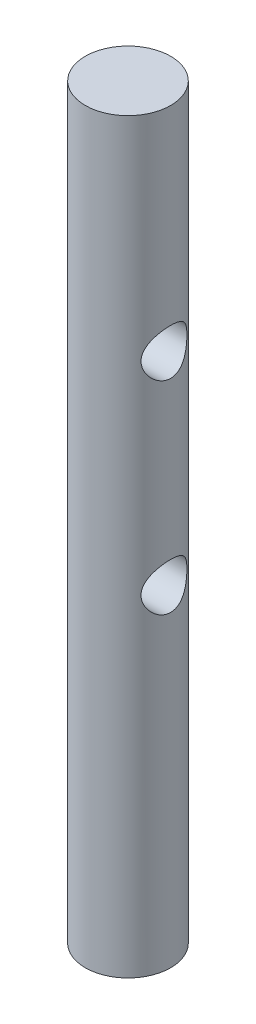
ISO-10303-21;
HEADER;
FILE_DESCRIPTION(('STEP AP214'),'2;1');
FILE_NAME('part.step','',(''),(''),'','','');
FILE_SCHEMA(('AUTOMOTIVE_DESIGN { 1 0 10303 214 1 1 1 1 }'));
ENDSEC;
DATA;
#1=APPLICATION_CONTEXT('core data for automotive mechanical design processes');
#2=APPLICATION_PROTOCOL_DEFINITION('international standard','automotive_design',2000,#1);
#3=PRODUCT_CONTEXT('',#1,'mechanical');
#4=PRODUCT('Part','Part','',(#3));
#5=PRODUCT_RELATED_PRODUCT_CATEGORY('part','',(#4));
#6=PRODUCT_DEFINITION_FORMATION('','',#4);
#7=PRODUCT_DEFINITION_CONTEXT('part definition',#1,'design');
#8=PRODUCT_DEFINITION('design','',#6,#7);
#9=PRODUCT_DEFINITION_SHAPE('','',#8);
#10=(LENGTH_UNIT() NAMED_UNIT(*) SI_UNIT(.MILLI.,.METRE.));
#11=(NAMED_UNIT(*) PLANE_ANGLE_UNIT() SI_UNIT($,.RADIAN.));
#12=(NAMED_UNIT(*) SI_UNIT($,.STERADIAN.) SOLID_ANGLE_UNIT());
#13=UNCERTAINTY_MEASURE_WITH_UNIT(LENGTH_MEASURE(1.E-05),#10,'distance_accuracy_value','');
#14=(GEOMETRIC_REPRESENTATION_CONTEXT(3) GLOBAL_UNCERTAINTY_ASSIGNED_CONTEXT((#13)) GLOBAL_UNIT_ASSIGNED_CONTEXT((#10,
#11,#12)) REPRESENTATION_CONTEXT('',''));
#15=CARTESIAN_POINT('',(0.,0.,0.));
#16=DIRECTION('',(0.,0.,1.));
#17=DIRECTION('',(1.,0.,0.));
#18=AXIS2_PLACEMENT_3D('',#15,#16,#17);
#19=CARTESIAN_POINT('',(0.,70.,0.));
#20=DIRECTION('',(0.,-1.,0.));
#21=DIRECTION('',(0.,0.,-1.));
#22=AXIS2_PLACEMENT_3D('',#19,#20,#21);
#23=CYLINDRICAL_SURFACE('',#22,4.);
#24=CARTESIAN_POINT('',(-4.,47.85,0.));
#25=CARTESIAN_POINT('',(-3.99999241042919,47.8500087172234,-0.111985083549888));
#26=CARTESIAN_POINT('',(-3.99524813697612,47.8588010255082,-0.224077490488077));
#27=CARTESIAN_POINT('',(-3.97673372012221,47.8935531917163,-0.444880967120356));
#28=CARTESIAN_POINT('',(-3.96295000909767,47.9195388563022,-0.553586696306075));
#29=CARTESIAN_POINT('',(-3.92778453505629,47.9873337720753,-0.764103901168655));
#30=CARTESIAN_POINT('',(-3.90643368940093,48.0290786796246,-0.86594145245919));
#31=CARTESIAN_POINT('',(-3.85803554037742,48.1268372396842,-1.06097774173743));
#32=CARTESIAN_POINT('',(-3.83098815527048,48.1828510969398,-1.15417635573871));
#33=CARTESIAN_POINT('',(-3.77148717336829,48.311775155938,-1.33628687887393));
#34=CARTESIAN_POINT('',(-3.73879318014561,48.3855638416462,-1.42449699630782));
#35=CARTESIAN_POINT('',(-3.67235783961419,48.5460229794877,-1.58795061149791));
#36=CARTESIAN_POINT('',(-3.63861559096915,48.6327047746383,-1.66318256424729));
#37=CARTESIAN_POINT('',(-3.57023950857991,48.8261033552469,-1.80560065254836));
#38=CARTESIAN_POINT('',(-3.53581462630107,48.9339337073277,-1.87138771426557));
#39=CARTESIAN_POINT('',(-3.47409559446628,49.161114484262,-1.98362962104654));
#40=CARTESIAN_POINT('',(-3.44679590325984,49.2804558568255,-2.03009950690743));
#41=CARTESIAN_POINT('',(-3.40516584404437,49.519776090643,-2.09914059071749));
#42=CARTESIAN_POINT('',(-3.390129360264,49.6392453871042,-2.12302804619301));
#43=CARTESIAN_POINT('',(-3.37299276237296,49.8813580710808,-2.15016503034598));
#44=CARTESIAN_POINT('',(-3.37087578577,50.0039971112893,-2.15344146062832));
#45=CARTESIAN_POINT('',(-3.37926908617843,50.2299621735856,-2.14022339446676));
#46=CARTESIAN_POINT('',(-3.38801064528115,50.3335338030288,-2.126499027442));
#47=CARTESIAN_POINT('',(-3.41398306573744,50.5365917213163,-2.08454378577752));
#48=CARTESIAN_POINT('',(-3.43121744815182,50.6360762971497,-2.05630689414518));
#49=CARTESIAN_POINT('',(-3.47255686356862,50.8309292631316,-1.98570998012338));
#50=CARTESIAN_POINT('',(-3.49680637319131,50.9261566256099,-1.94304940884755));
#51=CARTESIAN_POINT('',(-3.5494819153084,51.1085862709489,-1.84506639648014));
#52=CARTESIAN_POINT('',(-3.57790978699198,51.1957849922119,-1.78973837354591));
#53=CARTESIAN_POINT('',(-3.64086026982543,51.3734127309326,-1.65837107693041));
#54=CARTESIAN_POINT('',(-3.67565843778587,51.4623735182733,-1.58047165721853));
#55=CARTESIAN_POINT('',(-3.74404329998364,51.6266350389099,-1.41085349097821));
#56=CARTESIAN_POINT('',(-3.77762922261182,51.701927190649,-1.31912612856053));
#57=CARTESIAN_POINT('',(-3.84229866335277,51.841138546543,-1.11741582683789));
#58=CARTESIAN_POINT('',(-3.87310210413084,51.9040761879419,-1.00665800192928));
#59=CARTESIAN_POINT('',(-3.92619426387664,52.0098762667568,-0.774065516608712));
#60=CARTESIAN_POINT('',(-3.94849068166452,52.0527568636937,-0.652240995745133));
#61=CARTESIAN_POINT('',(-3.98030644034244,52.1132761052938,-0.412797211692436));
#62=CARTESIAN_POINT('',(-3.99080138540045,52.132851727303,-0.295799016079746));
#63=CARTESIAN_POINT('',(-4.00129452271238,52.1524250425793,-0.0597330243300772));
#64=CARTESIAN_POINT('',(-4.00129893855782,52.1524343437245,0.0593335028211603));
#65=CARTESIAN_POINT('',(-3.99132016755876,52.1338184571408,0.284399869544176));
#66=CARTESIAN_POINT('',(-3.98226017773824,52.1169157261968,0.390590169182914));
#67=CARTESIAN_POINT('',(-3.95637725730819,52.0678141724343,0.598366693495298));
#68=CARTESIAN_POINT('',(-3.93955352478026,52.0356137695063,0.699952441373293));
#69=CARTESIAN_POINT('',(-3.89911528070355,51.956219043406,0.898571189153841));
#70=CARTESIAN_POINT('',(-3.87534533639925,51.9086785926811,0.99543301370582));
#71=CARTESIAN_POINT('',(-3.82317096683462,51.8003850720905,1.18007767122399));
#72=CARTESIAN_POINT('',(-3.79476476110472,51.739626923219,1.26785699498088));
#73=CARTESIAN_POINT('',(-3.73230165289247,51.5990512465211,1.4420067470224));
#74=CARTESIAN_POINT('',(-3.69796619892198,51.5178794162935,1.52718528640786));
#75=CARTESIAN_POINT('',(-3.62955448193818,51.3426378968988,1.68333503411259));
#76=CARTESIAN_POINT('',(-3.59547849628594,51.2485560224493,1.75429266230863));
#77=CARTESIAN_POINT('',(-3.5289133178125,51.0420772707768,1.88480969934338));
#78=CARTESIAN_POINT('',(-3.49670129160335,50.9288600598413,1.94322649819338));
#79=CARTESIAN_POINT('',(-3.44139375848823,50.6919925495398,2.03959121842095));
#80=CARTESIAN_POINT('',(-3.41828518270863,50.5683575179847,2.07756851157813));
#81=CARTESIAN_POINT('',(-3.38696436894619,50.3269509175665,2.1282114277317));
#82=CARTESIAN_POINT('',(-3.3775159604708,50.2097890491257,2.14298986871183));
#83=CARTESIAN_POINT('',(-3.37110589298399,49.9743222783088,2.15306681805448));
#84=CARTESIAN_POINT('',(-3.37413521781325,49.8560182628726,2.14837939204122));
#85=CARTESIAN_POINT('',(-3.39095526288104,49.6373833976624,2.12169848755743));
#86=CARTESIAN_POINT('',(-3.4033522024359,49.5366556861827,2.10194354886375));
#87=CARTESIAN_POINT('',(-3.43562345400984,49.3401399524347,2.04876867511861));
#88=CARTESIAN_POINT('',(-3.45550060489385,49.244353821292,2.01534355158559));
#89=CARTESIAN_POINT('',(-3.50200902421991,49.0535958420442,1.93346217813749));
#90=CARTESIAN_POINT('',(-3.52899009970315,48.9590652286216,1.88418349989918));
#91=CARTESIAN_POINT('',(-3.58623565491193,48.7789804057067,1.77280466826671));
#92=CARTESIAN_POINT('',(-3.61650189580489,48.69343105987,1.71069762135228));
#93=CARTESIAN_POINT('',(-3.68224952917989,48.5205511696197,1.56471752559222));
#94=CARTESIAN_POINT('',(-3.71784105438733,48.4348230587722,1.47898463326489));
#95=CARTESIAN_POINT('',(-3.78631896326831,48.2784737950109,1.29366436225303));
#96=CARTESIAN_POINT('',(-3.81920354175472,48.2078626737577,1.19406785553323));
#97=CARTESIAN_POINT('',(-3.87972360692406,48.0822206247598,0.979989617524251));
#98=CARTESIAN_POINT('',(-3.90719519253341,48.0276568748057,0.865181032785213));
#99=CARTESIAN_POINT('',(-3.94118669682048,47.9614225009985,0.686122175517971));
#100=CARTESIAN_POINT('',(-3.95131064062383,47.9419532558644,0.625333387256215));
#101=CARTESIAN_POINT('',(-3.96887321153499,47.9084308283745,0.501914482823136));
#102=CARTESIAN_POINT('',(-3.97631330704083,47.8943746840955,0.439285393872384));
#103=CARTESIAN_POINT('',(-3.98812704014167,47.8721503741494,0.31416799923318));
#104=CARTESIAN_POINT('',(-3.99256578620078,47.863857076314,0.251708114126207));
#105=CARTESIAN_POINT('',(-3.99850441465378,47.8527794141583,0.126176849031563));
#106=CARTESIAN_POINT('',(-4.00000427684991,47.849995087699,0.063105464844301));
#107=CARTESIAN_POINT('',(-4.,47.85,0.));
#108=B_SPLINE_CURVE_WITH_KNOTS('',3,(#24,#25,#26,#27,#28,#29,#30,#31,#32,#33,#34,#35,#36,#37,
#38,#39,#40,#41,#42,#43,#44,#45,#46,#47,#48,#49,#50,#51,#52,#53,#54,#55,#56,#57,#58,#59,#60,#61,
#62,#63,#64,#65,#66,#67,#68,#69,#70,#71,#72,#73,#74,#75,#76,#77,#78,#79,#80,#81,#82,#83,#84,#85,
#86,#87,#88,#89,#90,#91,#92,#93,#94,#95,#96,#97,#98,#99,#100,#101,#102,#103,#104,#105,#106,
#107),.UNSPECIFIED.,.T.,.F.,(4,2,2,2,2,2,2,2,2,2,2,2,2,2,2,2,2,2,2,2,2,2,2,2,2,2,2,2,2,2,2,2,2,
2,2,2,2,2,2,2,2,4),(0.,0.335710391978373,0.671925820794775,1.00678310241752,1.34164518918348,
1.69886736408739,2.05640569313897,2.44719722292653,2.83768390091528,3.20367633738306,
3.56919097955531,3.88224513770468,4.19542919509354,4.51558861443918,4.83588938271311,
5.20410660078069,5.57255420254336,5.96361403901208,6.35431912374402,6.70958078958072,
7.06463169350078,7.38686237569236,7.70912634860158,8.03924028022703,8.36948128552757,
8.73564475995621,9.10215624984545,9.49427270335817,9.88582416673056,10.2390691232301,
10.5920588768167,10.9008858996852,11.2098302459518,11.5384708215192,11.8672884587277,
12.2446617203924,12.6222846366531,13.0100066433899,13.2036355995073,13.3971584553028,
13.5863355677526,13.7755139803349),.UNSPECIFIED.);
#109=CARTESIAN_POINT('',(-4.,47.85,0.));
#110=VERTEX_POINT('',#109);
#111=EDGE_CURVE('E10',#110,#110,#108,.T.);
#112=ORIENTED_EDGE('',*,*,#111,.T.);
#113=EDGE_LOOP('',(#112));
#114=FACE_BOUND('',#113,.T.);
#115=CARTESIAN_POINT('',(3.37305499510459,50.,-2.15));
#116=CARTESIAN_POINT('',(3.37306789537478,49.8893350463173,-2.14999014185175));
#117=CARTESIAN_POINT('',(3.37858717241774,49.7785567272247,-2.14139612338367));
#118=CARTESIAN_POINT('',(3.3998217485846,49.5605137953804,-2.10750636967658));
#119=CARTESIAN_POINT('',(3.4155552495845,49.4532558150743,-2.08218081720836));
#120=CARTESIAN_POINT('',(3.45484291183156,49.2458325735096,-2.01631028763128));
#121=CARTESIAN_POINT('',(3.47835014687402,49.1456290267439,-1.97585644534699));
#122=CARTESIAN_POINT('',(3.53046178707916,48.9534646806579,-1.88115733110661));
#123=CARTESIAN_POINT('',(3.55906708056218,48.8615053220652,-1.82690965491503));
#124=CARTESIAN_POINT('',(3.62149973907626,48.6786972630355,-1.70005797545115));
#125=CARTESIAN_POINT('',(3.65556474336205,48.5888063103755,-1.62619018009122));
#126=CARTESIAN_POINT('',(3.7231695035592,48.4219263740329,-1.46480980763115));
#127=CARTESIAN_POINT('',(3.75670894981218,48.3449447552128,-1.37728949626047));
#128=CARTESIAN_POINT('',(3.82272142222174,48.199944463291,-1.18245593288972));
#129=CARTESIAN_POINT('',(3.85488851267948,48.1331552272761,-1.07411410314494));
#130=CARTESIAN_POINT('',(3.91134641658503,48.0191954947069,-0.845676271264341));
#131=CARTESIAN_POINT('',(3.93564296040725,47.9720107174653,-0.725588904114212));
#132=CARTESIAN_POINT('',(3.97189156082669,47.9025670226586,-0.487258441810109));
#133=CARTESIAN_POINT('',(3.98467689173348,47.8786135261057,-0.369638859333745));
#134=CARTESIAN_POINT('',(3.99961676438921,47.8506786669519,-0.131414895413837));
#135=CARTESIAN_POINT('',(4.00177892888356,47.8466829834143,-0.0108127166307709));
#136=CARTESIAN_POINT('',(3.99557243249079,47.8582463878037,0.216988003873494));
#137=CARTESIAN_POINT('',(3.98823652784052,47.8718875495914,0.324319510822802));
#138=CARTESIAN_POINT('',(3.96548884658386,47.9148301988651,0.534896800249587));
#139=CARTESIAN_POINT('',(3.95007645476271,47.9441328793479,0.638142270834683));
#140=CARTESIAN_POINT('',(3.91232986436505,48.017620819849,0.839209608990634));
#141=CARTESIAN_POINT('',(3.88991675429745,48.061976273034,0.936953843931307));
#142=CARTESIAN_POINT('',(3.84010439961947,48.1640037166461,1.12381615039502));
#143=CARTESIAN_POINT('',(3.81270350085683,48.2216801265515,1.21293134511457));
#144=CARTESIAN_POINT('',(3.752014781827,48.3556018389876,1.38997536481928));
#145=CARTESIAN_POINT('',(3.71841097888255,48.4331587533067,1.47680399644096));
#146=CARTESIAN_POINT('',(3.65078811105395,48.6011886686653,1.6368602141135));
#147=CARTESIAN_POINT('',(3.61676867570349,48.6916740990869,1.71007455376526));
#148=CARTESIAN_POINT('',(3.54905905882505,48.8918945479125,1.84674260578548));
#149=CARTESIAN_POINT('',(3.51562078066523,49.0025966914159,1.90891783080781));
#150=CARTESIAN_POINT('',(3.45689645539282,49.2350194789083,2.01332684940976));
#151=CARTESIAN_POINT('',(3.43160111360784,49.3567273557098,2.05558340472758));
#152=CARTESIAN_POINT('',(3.39508047255527,49.59747711412,2.11531862175854));
#153=CARTESIAN_POINT('',(3.38288009820128,49.7159340800229,2.13452950112744));
#154=CARTESIAN_POINT('',(3.37125237940967,49.9549676938618,2.1528583314062));
#155=CARTESIAN_POINT('',(3.37181213295255,50.0755420775449,2.15199657813553));
#156=CARTESIAN_POINT('',(3.38460453637368,50.2978283063927,2.1317924184228));
#157=CARTESIAN_POINT('',(3.3952425118945,50.3998790662984,2.11497426680587));
#158=CARTESIAN_POINT('',(3.42448308957791,50.5994493488762,2.06729099521975));
#159=CARTESIAN_POINT('',(3.44308890000901,50.6969670287398,2.03642021660983));
#160=CARTESIAN_POINT('',(3.48708623185751,50.8896474489903,1.96016270775336));
#161=CARTESIAN_POINT('',(3.51273941909007,50.9845196529249,1.91419906852342));
#162=CARTESIAN_POINT('',(3.56777973616212,51.1657713784714,1.80954212711206));
#163=CARTESIAN_POINT('',(3.59716875236865,51.2521465702488,1.75084238331178));
#164=CARTESIAN_POINT('',(3.66165408169305,51.4275251071818,1.61213277386731));
#165=CARTESIAN_POINT('',(3.69694538866752,51.5149803734641,1.53024731550641));
#166=CARTESIAN_POINT('',(3.76556952597366,51.6754943307523,1.35261084365073));
#167=CARTESIAN_POINT('',(3.79890133527596,51.7485455621502,1.25685269001714));
#168=CARTESIAN_POINT('',(3.8616636197448,51.881091047291,1.04874151686809));
#169=CARTESIAN_POINT('',(3.89085981976057,51.9398529654631,0.935846009099768));
#170=CARTESIAN_POINT('',(3.94015574549761,52.036930251822,0.699756425140155));
#171=CARTESIAN_POINT('',(3.96026458481716,52.0752661119832,0.576572814354015));
#172=CARTESIAN_POINT('',(3.98745288662003,52.1266643534294,0.336632745437926));
#173=CARTESIAN_POINT('',(3.99563105151741,52.1418645732219,0.220459066464393));
#174=CARTESIAN_POINT('',(4.00168011534722,52.153130874201,-0.0130605996039325));
#175=CARTESIAN_POINT('',(3.99955591852327,52.1492060594929,-0.130406002378067));
#176=CARTESIAN_POINT('',(3.98585630357404,52.1235929270535,-0.3525841472124));
#177=CARTESIAN_POINT('',(3.97508141478424,52.1034087311606,-0.457646018734621));
#178=CARTESIAN_POINT('',(3.94608777677851,52.0480875486073,-0.662656904728558));
#179=CARTESIAN_POINT('',(3.92786809919704,52.0129486970778,-0.762605279797352));
#180=CARTESIAN_POINT('',(3.88474334072863,51.9274699563344,-0.958765195092645));
#181=CARTESIAN_POINT('',(3.85961641904406,51.8766170945434,-1.05470284380844));
#182=CARTESIAN_POINT('',(3.80510724203069,51.7617876105288,-1.23702384460647));
#183=CARTESIAN_POINT('',(3.77572317961469,51.6978054102873,-1.3234031117083));
#184=CARTESIAN_POINT('',(3.71161645414473,51.5503177220139,-1.4943685907413));
#185=CARTESIAN_POINT('',(3.6766639099958,51.4654305584838,-1.57767989919843));
#186=CARTESIAN_POINT('',(3.60775653843758,51.2828018389184,-1.72946671934421));
#187=CARTESIAN_POINT('',(3.57380287884023,51.1850459156707,-1.79792541935672));
#188=CARTESIAN_POINT('',(3.50886294538815,50.9723087123977,-1.92173339737901));
#189=CARTESIAN_POINT('',(3.47815599908049,50.8566633106906,-1.97611341019953));
#190=CARTESIAN_POINT('',(3.43965403428669,50.6761548511338,-2.04191598995994));
#191=CARTESIAN_POINT('',(3.42808643903416,50.6148672106237,-2.06121252432488));
#192=CARTESIAN_POINT('',(3.40796003321043,50.4903618965643,-2.0943221742592));
#193=CARTESIAN_POINT('',(3.39939924883849,50.4271455188598,-2.10813888779267));
#194=CARTESIAN_POINT('',(3.38616192910165,50.3035102539792,-2.12933205060795));
#195=CARTESIAN_POINT('',(3.38126925634517,50.2431762879179,-2.13706845744708));
#196=CARTESIAN_POINT('',(3.37471219276776,50.1219063622348,-2.14740521605444));
#197=CARTESIAN_POINT('',(3.37304788775546,50.0609703866552,-2.15000543130495));
#198=CARTESIAN_POINT('',(3.37305499510459,50.,-2.15));
#199=B_SPLINE_CURVE_WITH_KNOTS('',3,(#115,#116,#117,#118,#119,#120,#121,#122,#123,#124,#125,
#126,#127,#128,#129,#130,#131,#132,#133,#134,#135,#136,#137,#138,#139,#140,#141,#142,#143,#144,
#145,#146,#147,#148,#149,#150,#151,#152,#153,#154,#155,#156,#157,#158,#159,#160,#161,#162,#163,
#164,#165,#166,#167,#168,#169,#170,#171,#172,#173,#174,#175,#176,#177,#178,#179,#180,#181,#182,
#183,#184,#185,#186,#187,#188,#189,#190,#191,#192,#193,#194,#195,#196,#197,#198),.UNSPECIFIED.,
.T.,.F.,(4,2,2,2,2,2,2,2,2,2,2,2,2,2,2,2,2,2,2,2,2,2,2,2,2,2,2,2,2,2,2,2,2,2,2,2,2,2,2,2,2,4),
(0.,0.331745530493522,0.664083864484073,0.994451580639289,1.32487691869303,1.68708689145851,
2.04950280959027,2.44124671478238,2.8327047552984,3.19278997245689,3.55261676956287,
3.87641472989297,4.20023735865173,4.5278504965704,4.85557248284942,5.21759195930871,
5.57996185028377,5.97180954225215,6.36320836451632,6.72285031302336,7.08212863653676,
7.39264211308428,7.70328073638515,8.0275341170056,8.35195188117054,8.72501642454728,
9.09827366724856,9.48784955899893,9.87703387824718,10.2274356241817,10.5776705843959,
10.8987844452964,11.2199383613376,11.5529403019809,11.8860840129698,12.2563904771476,
12.6271139295875,13.0189616309974,13.2145522805288,13.4100142948696,13.5927832293714,
13.7755570217259),.UNSPECIFIED.);
#200=CARTESIAN_POINT('',(3.37305499510459,50.,-2.15));
#201=VERTEX_POINT('',#200);
#202=EDGE_CURVE('E43',#201,#201,#199,.T.);
#203=ORIENTED_EDGE('',*,*,#202,.T.);
#204=EDGE_LOOP('',(#203));
#205=FACE_BOUND('',#204,.T.);
#206=CARTESIAN_POINT('',(-4.,28.85,0.));
#207=CARTESIAN_POINT('',(-3.99999241042919,28.8500087172234,-0.111985083549888));
#208=CARTESIAN_POINT('',(-3.99524813697612,28.8588010255082,-0.224077490488077));
#209=CARTESIAN_POINT('',(-3.97673372012221,28.8935531917163,-0.444880967120357));
#210=CARTESIAN_POINT('',(-3.96295000909767,28.9195388563022,-0.553586696306076));
#211=CARTESIAN_POINT('',(-3.92778453505629,28.9873337720752,-0.764103901168657));
#212=CARTESIAN_POINT('',(-3.90643368940093,29.0290786796246,-0.865941452459192));
#213=CARTESIAN_POINT('',(-3.85803554037741,29.1268372396842,-1.06097774173743));
#214=CARTESIAN_POINT('',(-3.83098815527048,29.1828510969398,-1.15417635573871));
#215=CARTESIAN_POINT('',(-3.77148717336829,29.311775155938,-1.33628687887393));
#216=CARTESIAN_POINT('',(-3.73879318014561,29.3855638416462,-1.42449699630782));
#217=CARTESIAN_POINT('',(-3.67235783961419,29.5460229794877,-1.58795061149791));
#218=CARTESIAN_POINT('',(-3.63861559096915,29.6327047746383,-1.66318256424729));
#219=CARTESIAN_POINT('',(-3.5702395085799,29.8261033552469,-1.80560065254836));
#220=CARTESIAN_POINT('',(-3.53581462630107,29.9339337073277,-1.87138771426557));
#221=CARTESIAN_POINT('',(-3.47409559446628,30.161114484262,-1.98362962104654));
#222=CARTESIAN_POINT('',(-3.44679590325984,30.2804558568255,-2.03009950690743));
#223=CARTESIAN_POINT('',(-3.40516584404437,30.519776090643,-2.09914059071748));
#224=CARTESIAN_POINT('',(-3.390129360264,30.6392453871042,-2.12302804619301));
#225=CARTESIAN_POINT('',(-3.37299276237296,30.8813580710808,-2.15016503034598));
#226=CARTESIAN_POINT('',(-3.37087578577,31.0039971112893,-2.15344146062832));
#227=CARTESIAN_POINT('',(-3.37926908617843,31.2299621735856,-2.14022339446676));
#228=CARTESIAN_POINT('',(-3.38801064528115,31.3335338030287,-2.126499027442));
#229=CARTESIAN_POINT('',(-3.41398306573744,31.5365917213163,-2.08454378577752));
#230=CARTESIAN_POINT('',(-3.43121744815182,31.6360762971497,-2.05630689414518));
#231=CARTESIAN_POINT('',(-3.47255686356862,31.8309292631315,-1.98570998012338));
#232=CARTESIAN_POINT('',(-3.49680637319131,31.9261566256099,-1.94304940884755));
#233=CARTESIAN_POINT('',(-3.5494819153084,32.1085862709489,-1.84506639648014));
#234=CARTESIAN_POINT('',(-3.57790978699198,32.1957849922119,-1.78973837354591));
#235=CARTESIAN_POINT('',(-3.64086026982543,32.3734127309326,-1.65837107693041));
#236=CARTESIAN_POINT('',(-3.67565843778587,32.4623735182733,-1.58047165721853));
#237=CARTESIAN_POINT('',(-3.74404329998364,32.6266350389099,-1.41085349097821));
#238=CARTESIAN_POINT('',(-3.77762922261182,32.701927190649,-1.31912612856053));
#239=CARTESIAN_POINT('',(-3.84229866335277,32.841138546543,-1.1174158268379));
#240=CARTESIAN_POINT('',(-3.87310210413084,32.9040761879418,-1.00665800192928));
#241=CARTESIAN_POINT('',(-3.92619426387664,33.0098762667568,-0.774065516608716));
#242=CARTESIAN_POINT('',(-3.94849068166452,33.0527568636937,-0.652240995745135));
#243=CARTESIAN_POINT('',(-3.98030644034244,33.1132761052938,-0.412797211692437));
#244=CARTESIAN_POINT('',(-3.99080138540045,33.132851727303,-0.295799016079747));
#245=CARTESIAN_POINT('',(-4.00129452271238,33.1524250425793,-0.0597330243300778));
#246=CARTESIAN_POINT('',(-4.00129893855782,33.1524343437245,0.0593335028211598));
#247=CARTESIAN_POINT('',(-3.99132016755876,33.1338184571408,0.284399869544175));
#248=CARTESIAN_POINT('',(-3.98226017773824,33.1169157261968,0.390590169182913));
#249=CARTESIAN_POINT('',(-3.95637725730819,33.0678141724343,0.598366693495297));
#250=CARTESIAN_POINT('',(-3.93955352478026,33.0356137695063,0.699952441373292));
#251=CARTESIAN_POINT('',(-3.89911528070355,32.956219043406,0.898571189153841));
#252=CARTESIAN_POINT('',(-3.87534533639925,32.9086785926811,0.995433013705821));
#253=CARTESIAN_POINT('',(-3.82317096683462,32.8003850720905,1.18007767122399));
#254=CARTESIAN_POINT('',(-3.79476476110472,32.739626923219,1.26785699498088));
#255=CARTESIAN_POINT('',(-3.73230165289247,32.5990512465211,1.4420067470224));
#256=CARTESIAN_POINT('',(-3.69796619892198,32.5178794162935,1.52718528640786));
#257=CARTESIAN_POINT('',(-3.62955448193818,32.3426378968988,1.68333503411259));
#258=CARTESIAN_POINT('',(-3.59547849628594,32.2485560224493,1.75429266230863));
#259=CARTESIAN_POINT('',(-3.5289133178125,32.0420772707768,1.88480969934338));
#260=CARTESIAN_POINT('',(-3.49670129160335,31.9288600598413,1.94322649819338));
#261=CARTESIAN_POINT('',(-3.44139375848823,31.6919925495398,2.03959121842095));
#262=CARTESIAN_POINT('',(-3.41828518270863,31.5683575179847,2.07756851157813));
#263=CARTESIAN_POINT('',(-3.38696436894619,31.3269509175665,2.1282114277317));
#264=CARTESIAN_POINT('',(-3.3775159604708,31.2097890491257,2.14298986871183));
#265=CARTESIAN_POINT('',(-3.37110589298399,30.9743222783088,2.15306681805448));
#266=CARTESIAN_POINT('',(-3.37413521781325,30.8560182628726,2.14837939204122));
#267=CARTESIAN_POINT('',(-3.39095526288104,30.6373833976624,2.12169848755743));
#268=CARTESIAN_POINT('',(-3.4033522024359,30.5366556861827,2.10194354886376));
#269=CARTESIAN_POINT('',(-3.43562345400984,30.3401399524347,2.04876867511861));
#270=CARTESIAN_POINT('',(-3.45550060489384,30.244353821292,2.01534355158559));
#271=CARTESIAN_POINT('',(-3.50200902421991,30.0535958420442,1.9334621781375));
#272=CARTESIAN_POINT('',(-3.52899009970314,29.9590652286216,1.88418349989918));
#273=CARTESIAN_POINT('',(-3.58623565491193,29.7789804057067,1.77280466826671));
#274=CARTESIAN_POINT('',(-3.61650189580489,29.69343105987,1.71069762135228));
#275=CARTESIAN_POINT('',(-3.68224952917989,29.5205511696197,1.56471752559222));
#276=CARTESIAN_POINT('',(-3.71784105438733,29.4348230587722,1.47898463326489));
#277=CARTESIAN_POINT('',(-3.78631896326831,29.2784737950109,1.29366436225304));
#278=CARTESIAN_POINT('',(-3.81920354175472,29.2078626737577,1.19406785553323));
#279=CARTESIAN_POINT('',(-3.87972360692406,29.0822206247598,0.979989617524255));
#280=CARTESIAN_POINT('',(-3.90719519253341,29.0276568748057,0.865181032785216));
#281=CARTESIAN_POINT('',(-3.94118669682048,28.9614225009985,0.686122175517974));
#282=CARTESIAN_POINT('',(-3.95131064062383,28.9419532558644,0.625333387256217));
#283=CARTESIAN_POINT('',(-3.96887321153499,28.9084308283745,0.501914482823138));
#284=CARTESIAN_POINT('',(-3.97631330704083,28.8943746840955,0.439285393872386));
#285=CARTESIAN_POINT('',(-3.98812704014167,28.8721503741494,0.314167999233181));
#286=CARTESIAN_POINT('',(-3.99256578620078,28.863857076314,0.251708114126208));
#287=CARTESIAN_POINT('',(-3.99850441465378,28.8527794141583,0.126176849031562));
#288=CARTESIAN_POINT('',(-4.00000427684991,28.849995087699,0.0631054648443009));
#289=CARTESIAN_POINT('',(-4.,28.85,0.));
#290=B_SPLINE_CURVE_WITH_KNOTS('',3,(#206,#207,#208,#209,#210,#211,#212,#213,#214,#215,#216,
#217,#218,#219,#220,#221,#222,#223,#224,#225,#226,#227,#228,#229,#230,#231,#232,#233,#234,#235,
#236,#237,#238,#239,#240,#241,#242,#243,#244,#245,#246,#247,#248,#249,#250,#251,#252,#253,#254,
#255,#256,#257,#258,#259,#260,#261,#262,#263,#264,#265,#266,#267,#268,#269,#270,#271,#272,#273,
#274,#275,#276,#277,#278,#279,#280,#281,#282,#283,#284,#285,#286,#287,#288,#289),.UNSPECIFIED.,
.T.,.F.,(4,2,2,2,2,2,2,2,2,2,2,2,2,2,2,2,2,2,2,2,2,2,2,2,2,2,2,2,2,2,2,2,2,2,2,2,2,2,2,2,2,4),
(0.,0.335710391978374,0.671925820794775,1.00678310241753,1.34164518918347,1.69886736408739,
2.05640569313897,2.44719722292653,2.83768390091528,3.20367633738305,3.56919097955531,
3.88224513770468,4.19542919509353,4.51558861443918,4.83588938271311,5.20410660078069,
5.57255420254335,5.96361403901208,6.35431912374401,6.70958078958072,7.06463169350077,
7.38686237569236,7.70912634860157,8.03924028022703,8.36948128552756,8.73564475995621,
9.10215624984545,9.49427270335817,9.88582416673056,10.23906912323,10.5920588768167,
10.9008858996851,11.2098302459518,11.5384708215192,11.8672884587277,12.2446617203924,
12.622284636653,13.0100066433899,13.2036355995073,13.3971584553028,13.5863355677526,
13.7755139803349),.UNSPECIFIED.);
#291=CARTESIAN_POINT('',(-4.,28.85,0.));
#292=VERTEX_POINT('',#291);
#293=EDGE_CURVE('E47',#292,#292,#290,.T.);
#294=ORIENTED_EDGE('',*,*,#293,.T.);
#295=EDGE_LOOP('',(#294));
#296=FACE_BOUND('',#295,.T.);
#297=CARTESIAN_POINT('',(3.37305499510459,31.,-2.15));
#298=CARTESIAN_POINT('',(3.37306789537478,30.8893350463173,-2.14999014185175));
#299=CARTESIAN_POINT('',(3.37858717241774,30.7785567272247,-2.14139612338367));
#300=CARTESIAN_POINT('',(3.3998217485846,30.5605137953804,-2.10750636967658));
#301=CARTESIAN_POINT('',(3.4155552495845,30.4532558150743,-2.08218081720836));
#302=CARTESIAN_POINT('',(3.45484291183156,30.2458325735096,-2.01631028763128));
#303=CARTESIAN_POINT('',(3.47835014687402,30.1456290267438,-1.97585644534699));
#304=CARTESIAN_POINT('',(3.53046178707916,29.9534646806579,-1.88115733110661));
#305=CARTESIAN_POINT('',(3.55906708056218,29.8615053220652,-1.82690965491503));
#306=CARTESIAN_POINT('',(3.62149973907626,29.6786972630355,-1.70005797545115));
#307=CARTESIAN_POINT('',(3.65556474336205,29.5888063103755,-1.62619018009122));
#308=CARTESIAN_POINT('',(3.72316950355921,29.4219263740329,-1.46480980763114));
#309=CARTESIAN_POINT('',(3.75670894981219,29.3449447552128,-1.37728949626046));
#310=CARTESIAN_POINT('',(3.82272142222174,29.199944463291,-1.18245593288971));
#311=CARTESIAN_POINT('',(3.85488851267948,29.1331552272761,-1.07411410314494));
#312=CARTESIAN_POINT('',(3.91134641658503,29.0191954947069,-0.845676271264336));
#313=CARTESIAN_POINT('',(3.93564296040725,28.9720107174653,-0.725588904114207));
#314=CARTESIAN_POINT('',(3.97189156082669,28.9025670226586,-0.487258441810103));
#315=CARTESIAN_POINT('',(3.98467689173348,28.8786135261057,-0.369638859333739));
#316=CARTESIAN_POINT('',(3.99961676438921,28.8506786669519,-0.131414895413832));
#317=CARTESIAN_POINT('',(4.00177892888356,28.8466829834143,-0.0108127166307671));
#318=CARTESIAN_POINT('',(3.99557243249079,28.8582463878037,0.216988003873497));
#319=CARTESIAN_POINT('',(3.98823652784052,28.8718875495914,0.324319510822805));
#320=CARTESIAN_POINT('',(3.96548884658386,28.9148301988651,0.534896800249589));
#321=CARTESIAN_POINT('',(3.95007645476271,28.9441328793479,0.638142270834686));
#322=CARTESIAN_POINT('',(3.91232986436505,29.017620819849,0.839209608990637));
#323=CARTESIAN_POINT('',(3.88991675429745,29.061976273034,0.936953843931311));
#324=CARTESIAN_POINT('',(3.84010439961946,29.1640037166461,1.12381615039502));
#325=CARTESIAN_POINT('',(3.81270350085683,29.2216801265515,1.21293134511457));
#326=CARTESIAN_POINT('',(3.75201478182699,29.3556018389876,1.38997536481928));
#327=CARTESIAN_POINT('',(3.71841097888255,29.4331587533067,1.47680399644096));
#328=CARTESIAN_POINT('',(3.65078811105395,29.6011886686653,1.63686021411351));
#329=CARTESIAN_POINT('',(3.61676867570349,29.6916740990869,1.71007455376527));
#330=CARTESIAN_POINT('',(3.54905905882505,29.8918945479125,1.84674260578548));
#331=CARTESIAN_POINT('',(3.51562078066523,30.0025966914159,1.90891783080781));
#332=CARTESIAN_POINT('',(3.45689645539282,30.2350194789083,2.01332684940976));
#333=CARTESIAN_POINT('',(3.43160111360784,30.3567273557098,2.05558340472758));
#334=CARTESIAN_POINT('',(3.39508047255527,30.59747711412,2.11531862175854));
#335=CARTESIAN_POINT('',(3.38288009820128,30.7159340800229,2.13452950112745));
#336=CARTESIAN_POINT('',(3.37125237940967,30.9549676938618,2.1528583314062));
#337=CARTESIAN_POINT('',(3.37181213295255,31.0755420775448,2.15199657813553));
#338=CARTESIAN_POINT('',(3.38460453637368,31.2978283063927,2.1317924184228));
#339=CARTESIAN_POINT('',(3.3952425118945,31.3998790662984,2.11497426680587));
#340=CARTESIAN_POINT('',(3.42448308957791,31.5994493488762,2.06729099521975));
#341=CARTESIAN_POINT('',(3.44308890000901,31.6969670287398,2.03642021660983));
#342=CARTESIAN_POINT('',(3.48708623185751,31.8896474489903,1.96016270775336));
#343=CARTESIAN_POINT('',(3.51273941909008,31.9845196529249,1.91419906852342));
#344=CARTESIAN_POINT('',(3.56777973616212,32.1657713784714,1.80954212711206));
#345=CARTESIAN_POINT('',(3.59716875236865,32.2521465702488,1.75084238331178));
#346=CARTESIAN_POINT('',(3.66165408169305,32.4275251071818,1.61213277386731));
#347=CARTESIAN_POINT('',(3.69694538866752,32.5149803734641,1.53024731550641));
#348=CARTESIAN_POINT('',(3.76556952597366,32.6754943307523,1.35261084365073));
#349=CARTESIAN_POINT('',(3.79890133527596,32.7485455621502,1.25685269001713));
#350=CARTESIAN_POINT('',(3.8616636197448,32.881091047291,1.04874151686808));
#351=CARTESIAN_POINT('',(3.89085981976058,32.9398529654631,0.93584600909976));
#352=CARTESIAN_POINT('',(3.94015574549761,33.036930251822,0.699756425140149));
#353=CARTESIAN_POINT('',(3.96026458481716,33.0752661119832,0.576572814354011));
#354=CARTESIAN_POINT('',(3.98745288662003,33.1266643534294,0.336632745437924));
#355=CARTESIAN_POINT('',(3.99563105151742,33.1418645732219,0.22045906646439));
#356=CARTESIAN_POINT('',(4.00168011534722,33.153130874201,-0.0130605996039344));
#357=CARTESIAN_POINT('',(3.99955591852327,33.1492060594929,-0.130406002378069));
#358=CARTESIAN_POINT('',(3.98585630357404,33.1235929270535,-0.352584147212401));
#359=CARTESIAN_POINT('',(3.97508141478424,33.1034087311606,-0.457646018734623));
#360=CARTESIAN_POINT('',(3.94608777677851,33.0480875486073,-0.662656904728559));
#361=CARTESIAN_POINT('',(3.92786809919704,33.0129486970778,-0.762605279797353));
#362=CARTESIAN_POINT('',(3.88474334072863,32.9274699563344,-0.958765195092647));
#363=CARTESIAN_POINT('',(3.85961641904406,32.8766170945434,-1.05470284380845));
#364=CARTESIAN_POINT('',(3.80510724203069,32.7617876105288,-1.23702384460647));
#365=CARTESIAN_POINT('',(3.77572317961469,32.6978054102873,-1.3234031117083));
#366=CARTESIAN_POINT('',(3.71161645414473,32.5503177220139,-1.4943685907413));
#367=CARTESIAN_POINT('',(3.6766639099958,32.4654305584838,-1.57767989919843));
#368=CARTESIAN_POINT('',(3.60775653843758,32.2828018389184,-1.72946671934421));
#369=CARTESIAN_POINT('',(3.57380287884022,32.1850459156707,-1.79792541935672));
#370=CARTESIAN_POINT('',(3.50886294538815,31.9723087123977,-1.92173339737901));
#371=CARTESIAN_POINT('',(3.47815599908049,31.8566633106906,-1.97611341019954));
#372=CARTESIAN_POINT('',(3.43965403428668,31.6761548511338,-2.04191598995995));
#373=CARTESIAN_POINT('',(3.42808643903415,31.6148672106237,-2.06121252432488));
#374=CARTESIAN_POINT('',(3.40796003321043,31.4903618965643,-2.0943221742592));
#375=CARTESIAN_POINT('',(3.39939924883849,31.4271455188598,-2.10813888779267));
#376=CARTESIAN_POINT('',(3.38616192910165,31.3035102539792,-2.12933205060795));
#377=CARTESIAN_POINT('',(3.38126925634516,31.2431762879179,-2.13706845744708));
#378=CARTESIAN_POINT('',(3.37471219276776,31.1219063622348,-2.14740521605444));
#379=CARTESIAN_POINT('',(3.37304788775546,31.0609703866552,-2.15000543130495));
#380=CARTESIAN_POINT('',(3.37305499510459,31.,-2.15));
#381=B_SPLINE_CURVE_WITH_KNOTS('',3,(#297,#298,#299,#300,#301,#302,#303,#304,#305,#306,#307,
#308,#309,#310,#311,#312,#313,#314,#315,#316,#317,#318,#319,#320,#321,#322,#323,#324,#325,#326,
#327,#328,#329,#330,#331,#332,#333,#334,#335,#336,#337,#338,#339,#340,#341,#342,#343,#344,#345,
#346,#347,#348,#349,#350,#351,#352,#353,#354,#355,#356,#357,#358,#359,#360,#361,#362,#363,#364,
#365,#366,#367,#368,#369,#370,#371,#372,#373,#374,#375,#376,#377,#378,#379,#380),.UNSPECIFIED.,
.T.,.F.,(4,2,2,2,2,2,2,2,2,2,2,2,2,2,2,2,2,2,2,2,2,2,2,2,2,2,2,2,2,2,2,2,2,2,2,2,2,2,2,2,2,4),
(0.,0.331745530493526,0.664083864484077,0.994451580639289,1.32487691869303,1.68708689145851,
2.04950280959028,2.44124671478238,2.83270475529841,3.1927899724569,3.55261676956287,
3.87641472989297,4.20023735865174,4.5278504965704,4.85557248284942,5.21759195930872,
5.57996185028377,5.97180954225215,6.36320836451632,6.72285031302336,7.08212863653676,
7.39264211308428,7.70328073638515,8.0275341170056,8.35195188117054,8.72501642454728,
9.09827366724858,9.48784955899894,9.87703387824718,10.2274356241817,10.5776705843959,
10.8987844452964,11.2199383613376,11.5529403019809,11.8860840129698,12.2563904771476,
12.6271139295875,13.0189616309975,13.2145522805288,13.4100142948696,13.5927832293714,
13.7755570217259),.UNSPECIFIED.);
#382=CARTESIAN_POINT('',(3.37305499510459,31.,-2.15));
#383=VERTEX_POINT('',#382);
#384=EDGE_CURVE('E51',#383,#383,#381,.T.);
#385=ORIENTED_EDGE('',*,*,#384,.T.);
#386=EDGE_LOOP('',(#385));
#387=FACE_BOUND('',#386,.T.);
#388=CARTESIAN_POINT('',(0.,70.,0.));
#389=DIRECTION('',(0.,1.,0.));
#390=DIRECTION('',(0.,0.,1.));
#391=AXIS2_PLACEMENT_3D('',#388,#389,#390);
#392=CIRCLE('',#391,4.);
#393=CARTESIAN_POINT('',(0.,70.,4.));
#394=VERTEX_POINT('',#393);
#395=EDGE_CURVE('E79',#394,#394,#392,.T.);
#396=ORIENTED_EDGE('',*,*,#395,.F.);
#397=EDGE_LOOP('',(#396));
#398=FACE_BOUND('',#397,.T.);
#399=CARTESIAN_POINT('',(0.,0.,0.));
#400=DIRECTION('',(0.,1.,0.));
#401=DIRECTION('',(0.,0.,1.));
#402=AXIS2_PLACEMENT_3D('',#399,#400,#401);
#403=CIRCLE('',#402,4.);
#404=CARTESIAN_POINT('',(0.,0.,4.));
#405=VERTEX_POINT('',#404);
#406=EDGE_CURVE('E80',#405,#405,#403,.T.);
#407=ORIENTED_EDGE('',*,*,#406,.T.);
#408=EDGE_LOOP('',(#407));
#409=FACE_BOUND('',#408,.T.);
#410=ADVANCED_FACE('F32',(#114,#205,#296,#387,#398,#409),#23,.T.);
#411=CARTESIAN_POINT('',(0.,70.,0.));
#412=DIRECTION('',(0.,1.,0.));
#413=DIRECTION('',(0.,0.,1.));
#414=AXIS2_PLACEMENT_3D('',#411,#412,#413);
#415=PLANE('',#414);
#416=ORIENTED_EDGE('',*,*,#395,.T.);
#417=EDGE_LOOP('',(#416));
#418=FACE_BOUND('',#417,.T.);
#419=ADVANCED_FACE('F72',(#418),#415,.T.);
#420=CARTESIAN_POINT('',(0.,0.,0.));
#421=DIRECTION('',(0.,1.,0.));
#422=DIRECTION('',(0.,0.,1.));
#423=AXIS2_PLACEMENT_3D('',#420,#421,#422);
#424=PLANE('',#423);
#425=ORIENTED_EDGE('',*,*,#406,.F.);
#426=EDGE_LOOP('',(#425));
#427=FACE_BOUND('',#426,.T.);
#428=ADVANCED_FACE('F70',(#427),#424,.F.);
#429=CARTESIAN_POINT('',(4.,31.,0.));
#430=DIRECTION('',(1.,0.,0.));
#431=DIRECTION('',(0.,0.,-1.));
#432=AXIS2_PLACEMENT_3D('',#429,#430,#431);
#433=CYLINDRICAL_SURFACE('',#432,2.15);
#434=ORIENTED_EDGE('',*,*,#384,.F.);
#435=EDGE_LOOP('',(#434));
#436=FACE_BOUND('',#435,.T.);
#437=ORIENTED_EDGE('',*,*,#293,.F.);
#438=EDGE_LOOP('',(#437));
#439=FACE_BOUND('',#438,.T.);
#440=ADVANCED_FACE('F64',(#436,#439),#433,.F.);
#441=CARTESIAN_POINT('',(4.,50.,0.));
#442=DIRECTION('',(1.,0.,0.));
#443=DIRECTION('',(0.,0.,-1.));
#444=AXIS2_PLACEMENT_3D('',#441,#442,#443);
#445=CYLINDRICAL_SURFACE('',#444,2.15);
#446=ORIENTED_EDGE('',*,*,#202,.F.);
#447=EDGE_LOOP('',(#446));
#448=FACE_BOUND('',#447,.T.);
#449=ORIENTED_EDGE('',*,*,#111,.F.);
#450=EDGE_LOOP('',(#449));
#451=FACE_BOUND('',#450,.T.);
#452=ADVANCED_FACE('F61',(#448,#451),#445,.F.);
#453=CLOSED_SHELL('',(#410,#419,#428,#440,#452));
#454=MANIFOLD_SOLID_BREP('B2',#453);
#455=ADVANCED_BREP_SHAPE_REPRESENTATION('',(#18,#454),#14);
#456=SHAPE_DEFINITION_REPRESENTATION(#9,#455);
ENDSEC;
END-ISO-10303-21;
